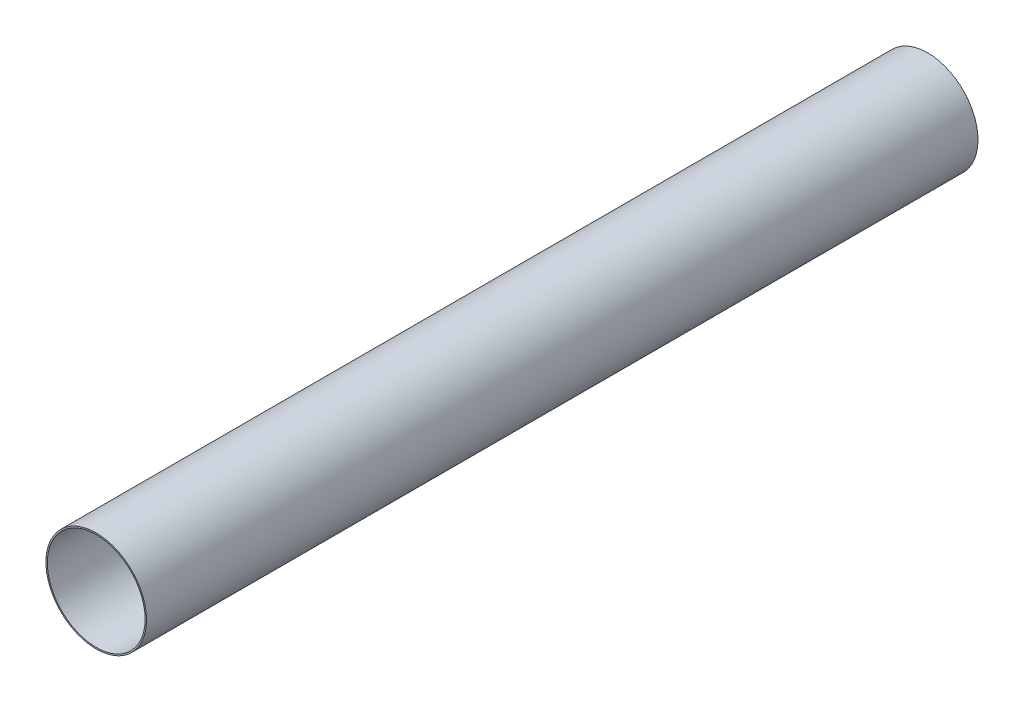
ISO-10303-21;
HEADER;
FILE_DESCRIPTION(('STEP AP214'),'2;1');
FILE_NAME('part.step','',(''),(''),'','','');
FILE_SCHEMA(('AUTOMOTIVE_DESIGN { 1 0 10303 214 1 1 1 1 }'));
ENDSEC;
DATA;
#1=APPLICATION_CONTEXT('core data for automotive mechanical design processes');
#2=APPLICATION_PROTOCOL_DEFINITION('international standard','automotive_design',2000,#1);
#3=PRODUCT_CONTEXT('',#1,'mechanical');
#4=PRODUCT('Part','Part','',(#3));
#5=PRODUCT_RELATED_PRODUCT_CATEGORY('part','',(#4));
#6=PRODUCT_DEFINITION_FORMATION('','',#4);
#7=PRODUCT_DEFINITION_CONTEXT('part definition',#1,'design');
#8=PRODUCT_DEFINITION('design','',#6,#7);
#9=PRODUCT_DEFINITION_SHAPE('','',#8);
#10=(LENGTH_UNIT() NAMED_UNIT(*) SI_UNIT(.MILLI.,.METRE.));
#11=(NAMED_UNIT(*) PLANE_ANGLE_UNIT() SI_UNIT($,.RADIAN.));
#12=(NAMED_UNIT(*) SI_UNIT($,.STERADIAN.) SOLID_ANGLE_UNIT());
#13=UNCERTAINTY_MEASURE_WITH_UNIT(LENGTH_MEASURE(1.E-05),#10,'distance_accuracy_value','');
#14=(GEOMETRIC_REPRESENTATION_CONTEXT(3) GLOBAL_UNCERTAINTY_ASSIGNED_CONTEXT((#13)) GLOBAL_UNIT_ASSIGNED_CONTEXT((#10,
#11,#12)) REPRESENTATION_CONTEXT('',''));
#15=CARTESIAN_POINT('',(0.,0.,0.));
#16=DIRECTION('',(0.,0.,1.));
#17=DIRECTION('',(1.,0.,0.));
#18=AXIS2_PLACEMENT_3D('',#15,#16,#17);
#19=CARTESIAN_POINT('',(0.,0.,1295.4));
#20=DIRECTION('',(0.,0.,1.));
#21=DIRECTION('',(1.,0.,0.));
#22=AXIS2_PLACEMENT_3D('',#19,#20,#21);
#23=PLANE('',#22);
#24=CARTESIAN_POINT('',(0.,0.,1295.4));
#25=DIRECTION('',(0.,0.,1.));
#26=DIRECTION('',(1.,0.,0.));
#27=AXIS2_PLACEMENT_3D('',#24,#25,#26);
#28=CIRCLE('',#27,78.359);
#29=CARTESIAN_POINT('',(78.359,0.,1295.4));
#30=VERTEX_POINT('',#29);
#31=EDGE_CURVE('E10',#30,#30,#28,.T.);
#32=ORIENTED_EDGE('',*,*,#31,.T.);
#33=EDGE_LOOP('',(#32));
#34=FACE_BOUND('',#33,.T.);
#35=CARTESIAN_POINT('',(0.,0.,1295.4));
#36=DIRECTION('',(0.,0.,1.));
#37=DIRECTION('',(1.,0.,0.));
#38=AXIS2_PLACEMENT_3D('',#35,#36,#37);
#39=CIRCLE('',#38,76.2);
#40=CARTESIAN_POINT('',(76.2,0.,1295.4));
#41=VERTEX_POINT('',#40);
#42=EDGE_CURVE('E50',#41,#41,#39,.T.);
#43=ORIENTED_EDGE('',*,*,#42,.F.);
#44=EDGE_LOOP('',(#43));
#45=FACE_BOUND('',#44,.T.);
#46=ADVANCED_FACE('F37',(#34,#45),#23,.T.);
#47=CARTESIAN_POINT('',(0.,0.,0.));
#48=DIRECTION('',(0.,0.,1.));
#49=DIRECTION('',(1.,0.,0.));
#50=AXIS2_PLACEMENT_3D('',#47,#48,#49);
#51=PLANE('',#50);
#52=CARTESIAN_POINT('',(0.,0.,0.));
#53=DIRECTION('',(0.,0.,1.));
#54=DIRECTION('',(1.,0.,0.));
#55=AXIS2_PLACEMENT_3D('',#52,#53,#54);
#56=CIRCLE('',#55,78.359);
#57=CARTESIAN_POINT('',(78.359,0.,0.));
#58=VERTEX_POINT('',#57);
#59=EDGE_CURVE('E41',#58,#58,#56,.T.);
#60=ORIENTED_EDGE('',*,*,#59,.F.);
#61=EDGE_LOOP('',(#60));
#62=FACE_BOUND('',#61,.T.);
#63=CARTESIAN_POINT('',(0.,0.,0.));
#64=DIRECTION('',(0.,0.,1.));
#65=DIRECTION('',(1.,0.,0.));
#66=AXIS2_PLACEMENT_3D('',#63,#64,#65);
#67=CIRCLE('',#66,76.2);
#68=CARTESIAN_POINT('',(76.2,0.,0.));
#69=VERTEX_POINT('',#68);
#70=EDGE_CURVE('E52',#69,#69,#67,.T.);
#71=ORIENTED_EDGE('',*,*,#70,.T.);
#72=EDGE_LOOP('',(#71));
#73=FACE_BOUND('',#72,.T.);
#74=ADVANCED_FACE('F64',(#62,#73),#51,.F.);
#75=CARTESIAN_POINT('',(0.,0.,1295.4));
#76=DIRECTION('',(0.,0.,-1.));
#77=DIRECTION('',(-1.,0.,0.));
#78=AXIS2_PLACEMENT_3D('',#75,#76,#77);
#79=CYLINDRICAL_SURFACE('',#78,78.359);
#80=ORIENTED_EDGE('',*,*,#31,.F.);
#81=EDGE_LOOP('',(#80));
#82=FACE_BOUND('',#81,.T.);
#83=ORIENTED_EDGE('',*,*,#59,.T.);
#84=EDGE_LOOP('',(#83));
#85=FACE_BOUND('',#84,.T.);
#86=ADVANCED_FACE('F39',(#82,#85),#79,.T.);
#87=CARTESIAN_POINT('',(0.,0.,1295.4));
#88=DIRECTION('',(0.,0.,-1.));
#89=DIRECTION('',(-1.,0.,0.));
#90=AXIS2_PLACEMENT_3D('',#87,#88,#89);
#91=CYLINDRICAL_SURFACE('',#90,76.2);
#92=ORIENTED_EDGE('',*,*,#42,.T.);
#93=EDGE_LOOP('',(#92));
#94=FACE_BOUND('',#93,.T.);
#95=ORIENTED_EDGE('',*,*,#70,.F.);
#96=EDGE_LOOP('',(#95));
#97=FACE_BOUND('',#96,.T.);
#98=ADVANCED_FACE('F60',(#94,#97),#91,.F.);
#99=CLOSED_SHELL('',(#46,#74,#86,#98));
#100=MANIFOLD_SOLID_BREP('B2',#99);
#101=ADVANCED_BREP_SHAPE_REPRESENTATION('',(#18,#100),#14);
#102=SHAPE_DEFINITION_REPRESENTATION(#9,#101);
ENDSEC;
END-ISO-10303-21;
